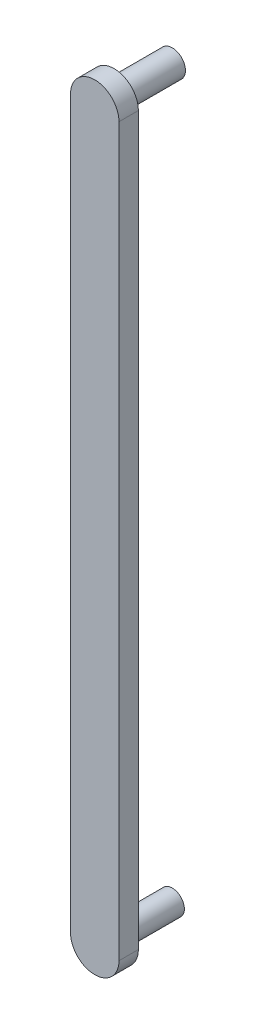
ISO-10303-21;
HEADER;
FILE_DESCRIPTION(('STEP AP214'),'2;1');
FILE_NAME('part.step','',(''),(''),'','','');
FILE_SCHEMA(('AUTOMOTIVE_DESIGN { 1 0 10303 214 1 1 1 1 }'));
ENDSEC;
DATA;
#1=APPLICATION_CONTEXT('core data for automotive mechanical design processes');
#2=APPLICATION_PROTOCOL_DEFINITION('international standard','automotive_design',2000,#1);
#3=PRODUCT_CONTEXT('',#1,'mechanical');
#4=PRODUCT('Part','Part','',(#3));
#5=PRODUCT_RELATED_PRODUCT_CATEGORY('part','',(#4));
#6=PRODUCT_DEFINITION_FORMATION('','',#4);
#7=PRODUCT_DEFINITION_CONTEXT('part definition',#1,'design');
#8=PRODUCT_DEFINITION('design','',#6,#7);
#9=PRODUCT_DEFINITION_SHAPE('','',#8);
#10=(LENGTH_UNIT() NAMED_UNIT(*) SI_UNIT(.MILLI.,.METRE.));
#11=(NAMED_UNIT(*) PLANE_ANGLE_UNIT() SI_UNIT($,.RADIAN.));
#12=(NAMED_UNIT(*) SI_UNIT($,.STERADIAN.) SOLID_ANGLE_UNIT());
#13=UNCERTAINTY_MEASURE_WITH_UNIT(LENGTH_MEASURE(1.E-05),#10,'distance_accuracy_value','');
#14=(GEOMETRIC_REPRESENTATION_CONTEXT(3) GLOBAL_UNCERTAINTY_ASSIGNED_CONTEXT((#13)) GLOBAL_UNIT_ASSIGNED_CONTEXT((#10,
#11,#12)) REPRESENTATION_CONTEXT('',''));
#15=CARTESIAN_POINT('',(0.,0.,0.));
#16=DIRECTION('',(0.,0.,1.));
#17=DIRECTION('',(1.,0.,0.));
#18=AXIS2_PLACEMENT_3D('',#15,#16,#17);
#19=CARTESIAN_POINT('',(0.,0.,2.54));
#20=DIRECTION('',(0.,0.,1.));
#21=DIRECTION('',(1.,0.,0.));
#22=AXIS2_PLACEMENT_3D('',#19,#20,#21);
#23=PLANE('',#22);
#24=CARTESIAN_POINT('',(0.,0.,2.54));
#25=DIRECTION('',(0.,0.,1.));
#26=DIRECTION('',(1.,0.,0.));
#27=AXIS2_PLACEMENT_3D('',#24,#25,#26);
#28=CIRCLE('',#27,3.175);
#29=CARTESIAN_POINT('',(3.175,0.,2.54));
#30=VERTEX_POINT('',#29);
#31=CARTESIAN_POINT('',(-3.175,0.,2.54));
#32=VERTEX_POINT('',#31);
#33=EDGE_CURVE('E96',#30,#32,#28,.T.);
#34=ORIENTED_EDGE('',*,*,#33,.T.);
#35=DIRECTION('',(0.,-1.,0.));
#36=VECTOR('',#35,1.);
#37=CARTESIAN_POINT('',(-3.175,0.,2.54));
#38=LINE('',#37,#36);
#39=CARTESIAN_POINT('',(-3.17499999999999,-95.25,2.54));
#40=VERTEX_POINT('',#39);
#41=EDGE_CURVE('E92',#32,#40,#38,.T.);
#42=ORIENTED_EDGE('',*,*,#41,.T.);
#43=CARTESIAN_POINT('',(0.,-95.25,2.54));
#44=DIRECTION('',(0.,0.,1.));
#45=DIRECTION('',(-1.,0.,0.));
#46=AXIS2_PLACEMENT_3D('',#43,#44,#45);
#47=CIRCLE('',#46,3.17499999999999);
#48=CARTESIAN_POINT('',(3.17499999999999,-95.25,2.54));
#49=VERTEX_POINT('',#48);
#50=EDGE_CURVE('E94',#40,#49,#47,.T.);
#51=ORIENTED_EDGE('',*,*,#50,.T.);
#52=DIRECTION('',(0.,1.,0.));
#53=VECTOR('',#52,1.);
#54=CARTESIAN_POINT('',(3.175,0.,2.54));
#55=LINE('',#54,#53);
#56=EDGE_CURVE('E62',#49,#30,#55,.T.);
#57=ORIENTED_EDGE('',*,*,#56,.T.);
#58=EDGE_LOOP('',(#34,#42,#51,#57));
#59=FACE_BOUND('',#58,.T.);
#60=ADVANCED_FACE('F43',(#59),#23,.T.);
#61=CARTESIAN_POINT('',(0.,0.,0.));
#62=DIRECTION('',(0.,0.,1.));
#63=DIRECTION('',(1.,0.,0.));
#64=AXIS2_PLACEMENT_3D('',#61,#62,#63);
#65=PLANE('',#64);
#66=CARTESIAN_POINT('',(0.,0.,0.));
#67=DIRECTION('',(0.,0.,1.));
#68=DIRECTION('',(1.,0.,0.));
#69=AXIS2_PLACEMENT_3D('',#66,#67,#68);
#70=CIRCLE('',#69,1.72979553968271);
#71=CARTESIAN_POINT('',(1.72979553968271,0.,0.));
#72=VERTEX_POINT('',#71);
#73=EDGE_CURVE('E47',#72,#72,#70,.T.);
#74=ORIENTED_EDGE('',*,*,#73,.T.);
#75=EDGE_LOOP('',(#74));
#76=FACE_BOUND('',#75,.T.);
#77=CARTESIAN_POINT('',(0.,0.,0.));
#78=DIRECTION('',(0.,0.,1.));
#79=DIRECTION('',(1.,0.,0.));
#80=AXIS2_PLACEMENT_3D('',#77,#78,#79);
#81=CIRCLE('',#80,3.175);
#82=CARTESIAN_POINT('',(3.175,0.,0.));
#83=VERTEX_POINT('',#82);
#84=CARTESIAN_POINT('',(-3.175,0.,0.));
#85=VERTEX_POINT('',#84);
#86=EDGE_CURVE('E113',#83,#85,#81,.T.);
#87=ORIENTED_EDGE('',*,*,#86,.F.);
#88=DIRECTION('',(0.,1.,0.));
#89=VECTOR('',#88,1.);
#90=CARTESIAN_POINT('',(3.175,0.,0.));
#91=LINE('',#90,#89);
#92=CARTESIAN_POINT('',(3.17499999999999,-95.25,0.));
#93=VERTEX_POINT('',#92);
#94=EDGE_CURVE('E85',#93,#83,#91,.T.);
#95=ORIENTED_EDGE('',*,*,#94,.F.);
#96=CARTESIAN_POINT('',(0.,-95.25,0.));
#97=DIRECTION('',(0.,0.,1.));
#98=DIRECTION('',(-1.,0.,0.));
#99=AXIS2_PLACEMENT_3D('',#96,#97,#98);
#100=CIRCLE('',#99,3.17499999999999);
#101=CARTESIAN_POINT('',(-3.17499999999999,-95.25,0.));
#102=VERTEX_POINT('',#101);
#103=EDGE_CURVE('E79',#102,#93,#100,.T.);
#104=ORIENTED_EDGE('',*,*,#103,.F.);
#105=DIRECTION('',(0.,-1.,0.));
#106=VECTOR('',#105,1.);
#107=CARTESIAN_POINT('',(-3.175,0.,0.));
#108=LINE('',#107,#106);
#109=EDGE_CURVE('E101',#85,#102,#108,.T.);
#110=ORIENTED_EDGE('',*,*,#109,.F.);
#111=EDGE_LOOP('',(#87,#95,#104,#110));
#112=FACE_BOUND('',#111,.T.);
#113=CARTESIAN_POINT('',(0.,-95.25,0.));
#114=DIRECTION('',(0.,0.,1.));
#115=DIRECTION('',(1.,0.,0.));
#116=AXIS2_PLACEMENT_3D('',#113,#114,#115);
#117=CIRCLE('',#116,1.5875);
#118=CARTESIAN_POINT('',(1.5875,-95.25,0.));
#119=VERTEX_POINT('',#118);
#120=EDGE_CURVE('E138',#119,#119,#117,.T.);
#121=ORIENTED_EDGE('',*,*,#120,.T.);
#122=EDGE_LOOP('',(#121));
#123=FACE_BOUND('',#122,.T.);
#124=ADVANCED_FACE('F129',(#76,#112,#123),#65,.F.);
#125=CARTESIAN_POINT('',(0.,0.,2.54));
#126=DIRECTION('',(0.,0.,-1.));
#127=DIRECTION('',(-1.,0.,0.));
#128=AXIS2_PLACEMENT_3D('',#125,#126,#127);
#129=CYLINDRICAL_SURFACE('',#128,3.175);
#130=ORIENTED_EDGE('',*,*,#86,.T.);
#131=DIRECTION('',(0.,0.,-1.));
#132=VECTOR('',#131,1.);
#133=CARTESIAN_POINT('',(-3.175,0.,2.54));
#134=LINE('',#133,#132);
#135=EDGE_CURVE('E11',#32,#85,#134,.T.);
#136=ORIENTED_EDGE('',*,*,#135,.F.);
#137=ORIENTED_EDGE('',*,*,#33,.F.);
#138=DIRECTION('',(0.,0.,-1.));
#139=VECTOR('',#138,1.);
#140=CARTESIAN_POINT('',(3.175,0.,2.54));
#141=LINE('',#140,#139);
#142=EDGE_CURVE('E109',#30,#83,#141,.T.);
#143=ORIENTED_EDGE('',*,*,#142,.T.);
#144=EDGE_LOOP('',(#130,#136,#137,#143));
#145=FACE_BOUND('',#144,.T.);
#146=ADVANCED_FACE('F45',(#145),#129,.T.);
#147=CARTESIAN_POINT('',(-3.175,0.,2.54));
#148=DIRECTION('',(1.,0.,0.));
#149=DIRECTION('',(0.,1.,0.));
#150=AXIS2_PLACEMENT_3D('',#147,#148,#149);
#151=PLANE('',#150);
#152=ORIENTED_EDGE('',*,*,#109,.T.);
#153=DIRECTION('',(0.,0.,-1.));
#154=VECTOR('',#153,1.);
#155=CARTESIAN_POINT('',(-3.17499999999999,-95.25,2.54));
#156=LINE('',#155,#154);
#157=EDGE_CURVE('E54',#40,#102,#156,.T.);
#158=ORIENTED_EDGE('',*,*,#157,.F.);
#159=ORIENTED_EDGE('',*,*,#41,.F.);
#160=ORIENTED_EDGE('',*,*,#135,.T.);
#161=EDGE_LOOP('',(#152,#158,#159,#160));
#162=FACE_BOUND('',#161,.T.);
#163=ADVANCED_FACE('F100',(#162),#151,.F.);
#164=CARTESIAN_POINT('',(0.,-95.25,2.54));
#165=DIRECTION('',(0.,0.,-1.));
#166=DIRECTION('',(-1.,0.,0.));
#167=AXIS2_PLACEMENT_3D('',#164,#165,#166);
#168=CYLINDRICAL_SURFACE('',#167,3.17499999999999);
#169=ORIENTED_EDGE('',*,*,#103,.T.);
#170=DIRECTION('',(0.,0.,-1.));
#171=VECTOR('',#170,1.);
#172=CARTESIAN_POINT('',(3.17499999999999,-95.25,2.54));
#173=LINE('',#172,#171);
#174=EDGE_CURVE('E103',#49,#93,#173,.T.);
#175=ORIENTED_EDGE('',*,*,#174,.F.);
#176=ORIENTED_EDGE('',*,*,#50,.F.);
#177=ORIENTED_EDGE('',*,*,#157,.T.);
#178=EDGE_LOOP('',(#169,#175,#176,#177));
#179=FACE_BOUND('',#178,.T.);
#180=ADVANCED_FACE('F105',(#179),#168,.T.);
#181=CARTESIAN_POINT('',(3.175,0.,2.54));
#182=DIRECTION('',(-1.,0.,0.));
#183=DIRECTION('',(0.,-1.,0.));
#184=AXIS2_PLACEMENT_3D('',#181,#182,#183);
#185=PLANE('',#184);
#186=ORIENTED_EDGE('',*,*,#94,.T.);
#187=ORIENTED_EDGE('',*,*,#142,.F.);
#188=ORIENTED_EDGE('',*,*,#56,.F.);
#189=ORIENTED_EDGE('',*,*,#174,.T.);
#190=EDGE_LOOP('',(#186,#187,#188,#189));
#191=FACE_BOUND('',#190,.T.);
#192=ADVANCED_FACE('F126',(#191),#185,.F.);
#193=CARTESIAN_POINT('',(0.,0.,-7.62));
#194=DIRECTION('',(0.,0.,1.));
#195=DIRECTION('',(1.,0.,0.));
#196=AXIS2_PLACEMENT_3D('',#193,#194,#195);
#197=CYLINDRICAL_SURFACE('',#196,1.72979553968271);
#198=CARTESIAN_POINT('',(0.,0.,-7.62));
#199=DIRECTION('',(0.,0.,1.));
#200=DIRECTION('',(1.,0.,0.));
#201=AXIS2_PLACEMENT_3D('',#198,#199,#200);
#202=CIRCLE('',#201,1.72979553968271);
#203=CARTESIAN_POINT('',(1.72979553968271,0.,-7.62));
#204=VERTEX_POINT('',#203);
#205=EDGE_CURVE('E134',#204,#204,#202,.T.);
#206=ORIENTED_EDGE('',*,*,#205,.T.);
#207=EDGE_LOOP('',(#206));
#208=FACE_BOUND('',#207,.T.);
#209=ORIENTED_EDGE('',*,*,#73,.F.);
#210=EDGE_LOOP('',(#209));
#211=FACE_BOUND('',#210,.T.);
#212=ADVANCED_FACE('F167',(#208,#211),#197,.T.);
#213=CARTESIAN_POINT('',(0.,0.,-7.62));
#214=DIRECTION('',(0.,0.,1.));
#215=DIRECTION('',(1.,0.,0.));
#216=AXIS2_PLACEMENT_3D('',#213,#214,#215);
#217=PLANE('',#216);
#218=ORIENTED_EDGE('',*,*,#205,.F.);
#219=EDGE_LOOP('',(#218));
#220=FACE_BOUND('',#219,.T.);
#221=ADVANCED_FACE('F156',(#220),#217,.F.);
#222=CARTESIAN_POINT('',(0.,-95.25,-7.62));
#223=DIRECTION('',(0.,0.,1.));
#224=DIRECTION('',(1.,0.,0.));
#225=AXIS2_PLACEMENT_3D('',#222,#223,#224);
#226=CYLINDRICAL_SURFACE('',#225,1.5875);
#227=CARTESIAN_POINT('',(0.,-95.25,-7.62));
#228=DIRECTION('',(0.,0.,1.));
#229=DIRECTION('',(1.,0.,0.));
#230=AXIS2_PLACEMENT_3D('',#227,#228,#229);
#231=CIRCLE('',#230,1.5875);
#232=CARTESIAN_POINT('',(1.5875,-95.25,-7.62));
#233=VERTEX_POINT('',#232);
#234=EDGE_CURVE('E142',#233,#233,#231,.T.);
#235=ORIENTED_EDGE('',*,*,#234,.T.);
#236=EDGE_LOOP('',(#235));
#237=FACE_BOUND('',#236,.T.);
#238=ORIENTED_EDGE('',*,*,#120,.F.);
#239=EDGE_LOOP('',(#238));
#240=FACE_BOUND('',#239,.T.);
#241=ADVANCED_FACE('F147',(#237,#240),#226,.T.);
#242=CARTESIAN_POINT('',(0.,-95.25,-7.62));
#243=DIRECTION('',(0.,0.,1.));
#244=DIRECTION('',(1.,0.,0.));
#245=AXIS2_PLACEMENT_3D('',#242,#243,#244);
#246=PLANE('',#245);
#247=ORIENTED_EDGE('',*,*,#234,.F.);
#248=EDGE_LOOP('',(#247));
#249=FACE_BOUND('',#248,.T.);
#250=ADVANCED_FACE('F150',(#249),#246,.F.);
#251=CLOSED_SHELL('',(#60,#124,#146,#163,#180,#192,#212,#221,#241,#250));
#252=MANIFOLD_SOLID_BREP('B2',#251);
#253=ADVANCED_BREP_SHAPE_REPRESENTATION('',(#18,#252),#14);
#254=SHAPE_DEFINITION_REPRESENTATION(#9,#253);
ENDSEC;
END-ISO-10303-21;
